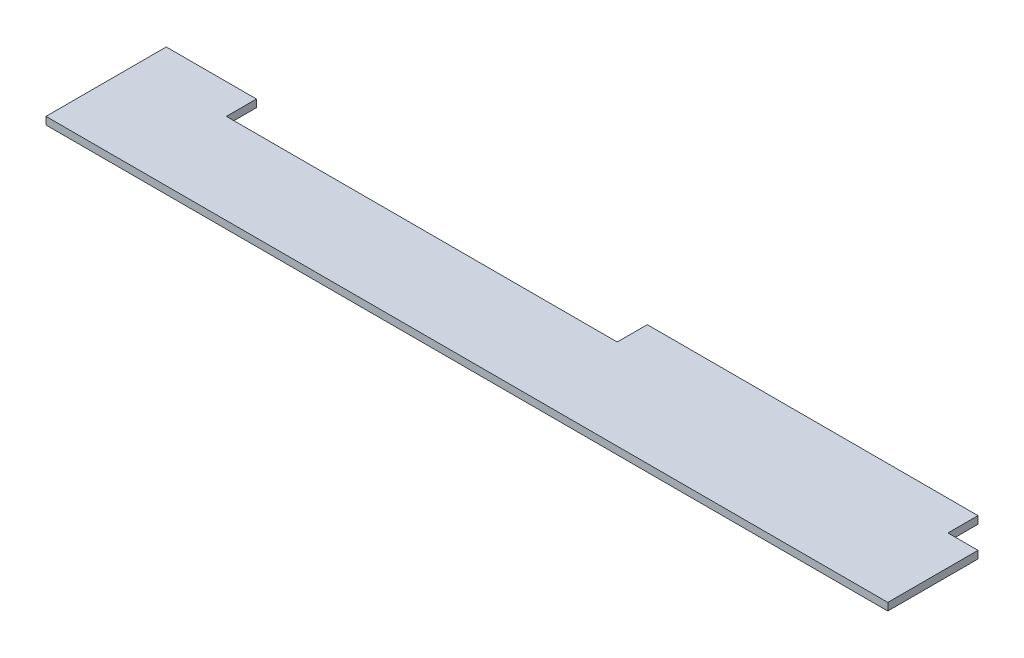
ISO-10303-21;
HEADER;
FILE_DESCRIPTION(('STEP AP214'),'2;1');
FILE_NAME('part.step','',(''),(''),'','','');
FILE_SCHEMA(('AUTOMOTIVE_DESIGN { 1 0 10303 214 1 1 1 1 }'));
ENDSEC;
DATA;
#1=APPLICATION_CONTEXT('core data for automotive mechanical design processes');
#2=APPLICATION_PROTOCOL_DEFINITION('international standard','automotive_design',2000,#1);
#3=PRODUCT_CONTEXT('',#1,'mechanical');
#4=PRODUCT('Part','Part','',(#3));
#5=PRODUCT_RELATED_PRODUCT_CATEGORY('part','',(#4));
#6=PRODUCT_DEFINITION_FORMATION('','',#4);
#7=PRODUCT_DEFINITION_CONTEXT('part definition',#1,'design');
#8=PRODUCT_DEFINITION('design','',#6,#7);
#9=PRODUCT_DEFINITION_SHAPE('','',#8);
#10=(LENGTH_UNIT() NAMED_UNIT(*) SI_UNIT(.MILLI.,.METRE.));
#11=(NAMED_UNIT(*) PLANE_ANGLE_UNIT() SI_UNIT($,.RADIAN.));
#12=(NAMED_UNIT(*) SI_UNIT($,.STERADIAN.) SOLID_ANGLE_UNIT());
#13=UNCERTAINTY_MEASURE_WITH_UNIT(LENGTH_MEASURE(1.E-05),#10,'distance_accuracy_value','');
#14=(GEOMETRIC_REPRESENTATION_CONTEXT(3) GLOBAL_UNCERTAINTY_ASSIGNED_CONTEXT((#13)) GLOBAL_UNIT_ASSIGNED_CONTEXT((#10,
#11,#12)) REPRESENTATION_CONTEXT('',''));
#15=CARTESIAN_POINT('',(0.,0.,0.));
#16=DIRECTION('',(0.,0.,1.));
#17=DIRECTION('',(1.,0.,0.));
#18=AXIS2_PLACEMENT_3D('',#15,#16,#17);
#19=CARTESIAN_POINT('',(-330.2,6.35,0.));
#20=DIRECTION('',(0.,0.,1.));
#21=DIRECTION('',(1.,0.,0.));
#22=AXIS2_PLACEMENT_3D('',#19,#20,#21);
#23=PLANE('',#22);
#24=DIRECTION('',(-1.,0.,0.));
#25=VECTOR('',#24,1.);
#26=CARTESIAN_POINT('',(-330.2,0.,0.));
#27=LINE('',#26,#25);
#28=CARTESIAN_POINT('',(0.,0.,0.));
#29=VERTEX_POINT('',#28);
#30=CARTESIAN_POINT('',(-330.2,0.,0.));
#31=VERTEX_POINT('',#30);
#32=EDGE_CURVE('E141',#29,#31,#27,.T.);
#33=ORIENTED_EDGE('',*,*,#32,.T.);
#34=DIRECTION('',(0.,-1.,0.));
#35=VECTOR('',#34,1.);
#36=CARTESIAN_POINT('',(-330.2,6.35,0.));
#37=LINE('',#36,#35);
#38=CARTESIAN_POINT('',(-330.2,6.35,0.));
#39=VERTEX_POINT('',#38);
#40=EDGE_CURVE('E11',#39,#31,#37,.T.);
#41=ORIENTED_EDGE('',*,*,#40,.F.);
#42=DIRECTION('',(-1.,0.,0.));
#43=VECTOR('',#42,1.);
#44=CARTESIAN_POINT('',(-330.2,6.35,0.));
#45=LINE('',#44,#43);
#46=CARTESIAN_POINT('',(0.,6.35,0.));
#47=VERTEX_POINT('',#46);
#48=EDGE_CURVE('E159',#47,#39,#45,.T.);
#49=ORIENTED_EDGE('',*,*,#48,.F.);
#50=DIRECTION('',(0.,-1.,0.));
#51=VECTOR('',#50,1.);
#52=CARTESIAN_POINT('',(0.,6.35,0.));
#53=LINE('',#52,#51);
#54=EDGE_CURVE('E137',#47,#29,#53,.T.);
#55=ORIENTED_EDGE('',*,*,#54,.T.);
#56=EDGE_LOOP('',(#33,#41,#49,#55));
#57=FACE_BOUND('',#56,.T.);
#58=ADVANCED_FACE('F33',(#57),#23,.F.);
#59=CARTESIAN_POINT('',(-330.2,6.35,-25.4));
#60=DIRECTION('',(-1.,0.,0.));
#61=DIRECTION('',(0.,0.,1.));
#62=AXIS2_PLACEMENT_3D('',#59,#60,#61);
#63=PLANE('',#62);
#64=DIRECTION('',(0.,0.,-1.));
#65=VECTOR('',#64,1.);
#66=CARTESIAN_POINT('',(-330.2,0.,-25.4));
#67=LINE('',#66,#65);
#68=CARTESIAN_POINT('',(-330.2,0.,-25.4));
#69=VERTEX_POINT('',#68);
#70=EDGE_CURVE('E144',#31,#69,#67,.T.);
#71=ORIENTED_EDGE('',*,*,#70,.T.);
#72=DIRECTION('',(0.,-1.,0.));
#73=VECTOR('',#72,1.);
#74=CARTESIAN_POINT('',(-330.2,6.35,-25.4));
#75=LINE('',#74,#73);
#76=CARTESIAN_POINT('',(-330.2,6.35,-25.4));
#77=VERTEX_POINT('',#76);
#78=EDGE_CURVE('E41',#77,#69,#75,.T.);
#79=ORIENTED_EDGE('',*,*,#78,.F.);
#80=DIRECTION('',(0.,0.,-1.));
#81=VECTOR('',#80,1.);
#82=CARTESIAN_POINT('',(-330.2,6.35,-25.4));
#83=LINE('',#82,#81);
#84=EDGE_CURVE('E98',#39,#77,#83,.T.);
#85=ORIENTED_EDGE('',*,*,#84,.F.);
#86=ORIENTED_EDGE('',*,*,#40,.T.);
#87=EDGE_LOOP('',(#71,#79,#85,#86));
#88=FACE_BOUND('',#87,.T.);
#89=ADVANCED_FACE('F208',(#88),#63,.F.);
#90=CARTESIAN_POINT('',(-406.4,6.35,-25.4));
#91=DIRECTION('',(0.,0.,1.));
#92=DIRECTION('',(1.,0.,0.));
#93=AXIS2_PLACEMENT_3D('',#90,#91,#92);
#94=PLANE('',#93);
#95=DIRECTION('',(-1.,0.,0.));
#96=VECTOR('',#95,1.);
#97=CARTESIAN_POINT('',(-406.4,0.,-25.4));
#98=LINE('',#97,#96);
#99=CARTESIAN_POINT('',(-406.4,0.,-25.4));
#100=VERTEX_POINT('',#99);
#101=EDGE_CURVE('E146',#69,#100,#98,.T.);
#102=ORIENTED_EDGE('',*,*,#101,.T.);
#103=DIRECTION('',(0.,-1.,0.));
#104=VECTOR('',#103,1.);
#105=CARTESIAN_POINT('',(-406.4,6.35,-25.4));
#106=LINE('',#105,#104);
#107=CARTESIAN_POINT('',(-406.4,6.35,-25.4));
#108=VERTEX_POINT('',#107);
#109=EDGE_CURVE('E172',#108,#100,#106,.T.);
#110=ORIENTED_EDGE('',*,*,#109,.F.);
#111=DIRECTION('',(-1.,0.,0.));
#112=VECTOR('',#111,1.);
#113=CARTESIAN_POINT('',(-406.4,6.35,-25.4));
#114=LINE('',#113,#112);
#115=EDGE_CURVE('E180',#77,#108,#114,.T.);
#116=ORIENTED_EDGE('',*,*,#115,.F.);
#117=ORIENTED_EDGE('',*,*,#78,.T.);
#118=EDGE_LOOP('',(#102,#110,#116,#117));
#119=FACE_BOUND('',#118,.T.);
#120=ADVANCED_FACE('F178',(#119),#94,.F.);
#121=CARTESIAN_POINT('',(-406.4,6.35,76.2000000000001));
#122=DIRECTION('',(1.,0.,0.));
#123=DIRECTION('',(0.,0.,-1.));
#124=AXIS2_PLACEMENT_3D('',#121,#122,#123);
#125=PLANE('',#124);
#126=DIRECTION('',(0.,0.,1.));
#127=VECTOR('',#126,1.);
#128=CARTESIAN_POINT('',(-406.4,0.,76.2000000000001));
#129=LINE('',#128,#127);
#130=CARTESIAN_POINT('',(-406.4,0.,76.2000000000001));
#131=VERTEX_POINT('',#130);
#132=EDGE_CURVE('E148',#100,#131,#129,.T.);
#133=ORIENTED_EDGE('',*,*,#132,.T.);
#134=DIRECTION('',(0.,-1.,0.));
#135=VECTOR('',#134,1.);
#136=CARTESIAN_POINT('',(-406.4,6.35,76.2000000000001));
#137=LINE('',#136,#135);
#138=CARTESIAN_POINT('',(-406.4,6.35,76.2000000000001));
#139=VERTEX_POINT('',#138);
#140=EDGE_CURVE('E169',#139,#131,#137,.T.);
#141=ORIENTED_EDGE('',*,*,#140,.F.);
#142=DIRECTION('',(0.,0.,1.));
#143=VECTOR('',#142,1.);
#144=CARTESIAN_POINT('',(-406.4,6.35,76.2000000000001));
#145=LINE('',#144,#143);
#146=EDGE_CURVE('E198',#108,#139,#145,.T.);
#147=ORIENTED_EDGE('',*,*,#146,.F.);
#148=ORIENTED_EDGE('',*,*,#109,.T.);
#149=EDGE_LOOP('',(#133,#141,#147,#148));
#150=FACE_BOUND('',#149,.T.);
#151=ADVANCED_FACE('F189',(#150),#125,.F.);
#152=CARTESIAN_POINT('',(304.8,6.35,76.2));
#153=DIRECTION('',(0.,0.,-1.));
#154=DIRECTION('',(-1.,0.,0.));
#155=AXIS2_PLACEMENT_3D('',#152,#153,#154);
#156=PLANE('',#155);
#157=DIRECTION('',(1.,0.,0.));
#158=VECTOR('',#157,1.);
#159=CARTESIAN_POINT('',(304.8,0.,76.2));
#160=LINE('',#159,#158);
#161=CARTESIAN_POINT('',(304.8,0.,76.2));
#162=VERTEX_POINT('',#161);
#163=EDGE_CURVE('E150',#131,#162,#160,.T.);
#164=ORIENTED_EDGE('',*,*,#163,.T.);
#165=DIRECTION('',(0.,-1.,0.));
#166=VECTOR('',#165,1.);
#167=CARTESIAN_POINT('',(304.8,6.35,76.2));
#168=LINE('',#167,#166);
#169=CARTESIAN_POINT('',(304.8,6.35,76.2));
#170=VERTEX_POINT('',#169);
#171=EDGE_CURVE('E166',#170,#162,#168,.T.);
#172=ORIENTED_EDGE('',*,*,#171,.F.);
#173=DIRECTION('',(1.,0.,0.));
#174=VECTOR('',#173,1.);
#175=CARTESIAN_POINT('',(304.8,6.35,76.2));
#176=LINE('',#175,#174);
#177=EDGE_CURVE('E195',#139,#170,#176,.T.);
#178=ORIENTED_EDGE('',*,*,#177,.F.);
#179=ORIENTED_EDGE('',*,*,#140,.T.);
#180=EDGE_LOOP('',(#164,#172,#178,#179));
#181=FACE_BOUND('',#180,.T.);
#182=ADVANCED_FACE('F193',(#181),#156,.F.);
#183=CARTESIAN_POINT('',(304.8,6.35,0.));
#184=DIRECTION('',(-1.,0.,0.));
#185=DIRECTION('',(0.,0.,1.));
#186=AXIS2_PLACEMENT_3D('',#183,#184,#185);
#187=PLANE('',#186);
#188=DIRECTION('',(0.,0.,-1.));
#189=VECTOR('',#188,1.);
#190=CARTESIAN_POINT('',(304.8,0.,0.));
#191=LINE('',#190,#189);
#192=CARTESIAN_POINT('',(304.8,0.,0.));
#193=VERTEX_POINT('',#192);
#194=EDGE_CURVE('E152',#162,#193,#191,.T.);
#195=ORIENTED_EDGE('',*,*,#194,.T.);
#196=DIRECTION('',(0.,-1.,0.));
#197=VECTOR('',#196,1.);
#198=CARTESIAN_POINT('',(304.8,6.35,0.));
#199=LINE('',#198,#197);
#200=CARTESIAN_POINT('',(304.8,6.35,0.));
#201=VERTEX_POINT('',#200);
#202=EDGE_CURVE('E163',#201,#193,#199,.T.);
#203=ORIENTED_EDGE('',*,*,#202,.F.);
#204=DIRECTION('',(0.,0.,-1.));
#205=VECTOR('',#204,1.);
#206=CARTESIAN_POINT('',(304.8,6.35,0.));
#207=LINE('',#206,#205);
#208=EDGE_CURVE('E197',#170,#201,#207,.T.);
#209=ORIENTED_EDGE('',*,*,#208,.F.);
#210=ORIENTED_EDGE('',*,*,#171,.T.);
#211=EDGE_LOOP('',(#195,#203,#209,#210));
#212=FACE_BOUND('',#211,.T.);
#213=ADVANCED_FACE('F220',(#212),#187,.F.);
#214=CARTESIAN_POINT('',(279.4,6.35,0.));
#215=DIRECTION('',(0.,0.,1.));
#216=DIRECTION('',(1.,0.,0.));
#217=AXIS2_PLACEMENT_3D('',#214,#215,#216);
#218=PLANE('',#217);
#219=DIRECTION('',(-1.,0.,0.));
#220=VECTOR('',#219,1.);
#221=CARTESIAN_POINT('',(279.4,0.,0.));
#222=LINE('',#221,#220);
#223=CARTESIAN_POINT('',(279.4,0.,0.));
#224=VERTEX_POINT('',#223);
#225=EDGE_CURVE('E154',#193,#224,#222,.T.);
#226=ORIENTED_EDGE('',*,*,#225,.T.);
#227=DIRECTION('',(0.,-1.,0.));
#228=VECTOR('',#227,1.);
#229=CARTESIAN_POINT('',(279.4,6.35,0.));
#230=LINE('',#229,#228);
#231=CARTESIAN_POINT('',(279.4,6.35,0.));
#232=VERTEX_POINT('',#231);
#233=EDGE_CURVE('E132',#232,#224,#230,.T.);
#234=ORIENTED_EDGE('',*,*,#233,.F.);
#235=DIRECTION('',(-1.,0.,0.));
#236=VECTOR('',#235,1.);
#237=CARTESIAN_POINT('',(279.4,6.35,0.));
#238=LINE('',#237,#236);
#239=EDGE_CURVE('E123',#201,#232,#238,.T.);
#240=ORIENTED_EDGE('',*,*,#239,.F.);
#241=ORIENTED_EDGE('',*,*,#202,.T.);
#242=EDGE_LOOP('',(#226,#234,#240,#241));
#243=FACE_BOUND('',#242,.T.);
#244=ADVANCED_FACE('F223',(#243),#218,.F.);
#245=CARTESIAN_POINT('',(279.4,6.35,-25.4));
#246=DIRECTION('',(-1.,0.,0.));
#247=DIRECTION('',(0.,0.,1.));
#248=AXIS2_PLACEMENT_3D('',#245,#246,#247);
#249=PLANE('',#248);
#250=DIRECTION('',(0.,0.,-1.));
#251=VECTOR('',#250,1.);
#252=CARTESIAN_POINT('',(279.4,0.,-25.4));
#253=LINE('',#252,#251);
#254=CARTESIAN_POINT('',(279.4,0.,-25.4));
#255=VERTEX_POINT('',#254);
#256=EDGE_CURVE('E131',#224,#255,#253,.T.);
#257=ORIENTED_EDGE('',*,*,#256,.T.);
#258=DIRECTION('',(0.,-1.,0.));
#259=VECTOR('',#258,1.);
#260=CARTESIAN_POINT('',(279.4,6.35,-25.4));
#261=LINE('',#260,#259);
#262=CARTESIAN_POINT('',(279.4,6.35,-25.4));
#263=VERTEX_POINT('',#262);
#264=EDGE_CURVE('E128',#263,#255,#261,.T.);
#265=ORIENTED_EDGE('',*,*,#264,.F.);
#266=DIRECTION('',(0.,0.,-1.));
#267=VECTOR('',#266,1.);
#268=CARTESIAN_POINT('',(279.4,6.35,-25.4));
#269=LINE('',#268,#267);
#270=EDGE_CURVE('E117',#232,#263,#269,.T.);
#271=ORIENTED_EDGE('',*,*,#270,.F.);
#272=ORIENTED_EDGE('',*,*,#233,.T.);
#273=EDGE_LOOP('',(#257,#265,#271,#272));
#274=FACE_BOUND('',#273,.T.);
#275=ADVANCED_FACE('F129',(#274),#249,.F.);
#276=CARTESIAN_POINT('',(0.,6.35,-25.4));
#277=DIRECTION('',(0.,0.,1.));
#278=DIRECTION('',(1.,0.,0.));
#279=AXIS2_PLACEMENT_3D('',#276,#277,#278);
#280=PLANE('',#279);
#281=DIRECTION('',(-1.,0.,0.));
#282=VECTOR('',#281,1.);
#283=CARTESIAN_POINT('',(0.,0.,-25.4));
#284=LINE('',#283,#282);
#285=CARTESIAN_POINT('',(0.,0.,-25.4));
#286=VERTEX_POINT('',#285);
#287=EDGE_CURVE('E84',#255,#286,#284,.T.);
#288=ORIENTED_EDGE('',*,*,#287,.T.);
#289=DIRECTION('',(0.,-1.,0.));
#290=VECTOR('',#289,1.);
#291=CARTESIAN_POINT('',(0.,6.35,-25.4));
#292=LINE('',#291,#290);
#293=CARTESIAN_POINT('',(0.,6.35,-25.4));
#294=VERTEX_POINT('',#293);
#295=EDGE_CURVE('E133',#294,#286,#292,.T.);
#296=ORIENTED_EDGE('',*,*,#295,.F.);
#297=DIRECTION('',(-1.,0.,0.));
#298=VECTOR('',#297,1.);
#299=CARTESIAN_POINT('',(0.,6.35,-25.4));
#300=LINE('',#299,#298);
#301=EDGE_CURVE('E121',#263,#294,#300,.T.);
#302=ORIENTED_EDGE('',*,*,#301,.F.);
#303=ORIENTED_EDGE('',*,*,#264,.T.);
#304=EDGE_LOOP('',(#288,#296,#302,#303));
#305=FACE_BOUND('',#304,.T.);
#306=ADVANCED_FACE('F135',(#305),#280,.F.);
#307=CARTESIAN_POINT('',(0.,6.35,0.));
#308=DIRECTION('',(1.,0.,0.));
#309=DIRECTION('',(0.,0.,-1.));
#310=AXIS2_PLACEMENT_3D('',#307,#308,#309);
#311=PLANE('',#310);
#312=DIRECTION('',(0.,0.,1.));
#313=VECTOR('',#312,1.);
#314=CARTESIAN_POINT('',(0.,0.,0.));
#315=LINE('',#314,#313);
#316=EDGE_CURVE('E90',#286,#29,#315,.T.);
#317=ORIENTED_EDGE('',*,*,#316,.T.);
#318=ORIENTED_EDGE('',*,*,#54,.F.);
#319=DIRECTION('',(0.,0.,1.));
#320=VECTOR('',#319,1.);
#321=CARTESIAN_POINT('',(0.,6.35,0.));
#322=LINE('',#321,#320);
#323=EDGE_CURVE('E49',#294,#47,#322,.T.);
#324=ORIENTED_EDGE('',*,*,#323,.F.);
#325=ORIENTED_EDGE('',*,*,#295,.T.);
#326=EDGE_LOOP('',(#317,#318,#324,#325));
#327=FACE_BOUND('',#326,.T.);
#328=ADVANCED_FACE('F232',(#327),#311,.F.);
#329=CARTESIAN_POINT('',(0.,6.35,0.));
#330=DIRECTION('',(0.,1.,0.));
#331=DIRECTION('',(0.,0.,1.));
#332=AXIS2_PLACEMENT_3D('',#329,#330,#331);
#333=PLANE('',#332);
#334=ORIENTED_EDGE('',*,*,#48,.T.);
#335=ORIENTED_EDGE('',*,*,#84,.T.);
#336=ORIENTED_EDGE('',*,*,#115,.T.);
#337=ORIENTED_EDGE('',*,*,#146,.T.);
#338=ORIENTED_EDGE('',*,*,#177,.T.);
#339=ORIENTED_EDGE('',*,*,#208,.T.);
#340=ORIENTED_EDGE('',*,*,#239,.T.);
#341=ORIENTED_EDGE('',*,*,#270,.T.);
#342=ORIENTED_EDGE('',*,*,#301,.T.);
#343=ORIENTED_EDGE('',*,*,#323,.T.);
#344=EDGE_LOOP('',(#334,#335,#336,#337,#338,#339,#340,#341,#342,#343));
#345=FACE_BOUND('',#344,.T.);
#346=ADVANCED_FACE('F119',(#345),#333,.T.);
#347=CARTESIAN_POINT('',(0.,0.,0.));
#348=DIRECTION('',(0.,1.,0.));
#349=DIRECTION('',(0.,0.,1.));
#350=AXIS2_PLACEMENT_3D('',#347,#348,#349);
#351=PLANE('',#350);
#352=ORIENTED_EDGE('',*,*,#32,.F.);
#353=ORIENTED_EDGE('',*,*,#316,.F.);
#354=ORIENTED_EDGE('',*,*,#287,.F.);
#355=ORIENTED_EDGE('',*,*,#256,.F.);
#356=ORIENTED_EDGE('',*,*,#225,.F.);
#357=ORIENTED_EDGE('',*,*,#194,.F.);
#358=ORIENTED_EDGE('',*,*,#163,.F.);
#359=ORIENTED_EDGE('',*,*,#132,.F.);
#360=ORIENTED_EDGE('',*,*,#101,.F.);
#361=ORIENTED_EDGE('',*,*,#70,.F.);
#362=EDGE_LOOP('',(#352,#353,#354,#355,#356,#357,#358,#359,#360,#361));
#363=FACE_BOUND('',#362,.T.);
#364=ADVANCED_FACE('F184',(#363),#351,.F.);
#365=CLOSED_SHELL('',(#58,#89,#120,#151,#182,#213,#244,#275,#306,#328,#346,#364));
#366=MANIFOLD_SOLID_BREP('B2',#365);
#367=ADVANCED_BREP_SHAPE_REPRESENTATION('',(#18,#366),#14);
#368=SHAPE_DEFINITION_REPRESENTATION(#9,#367);
ENDSEC;
END-ISO-10303-21;
